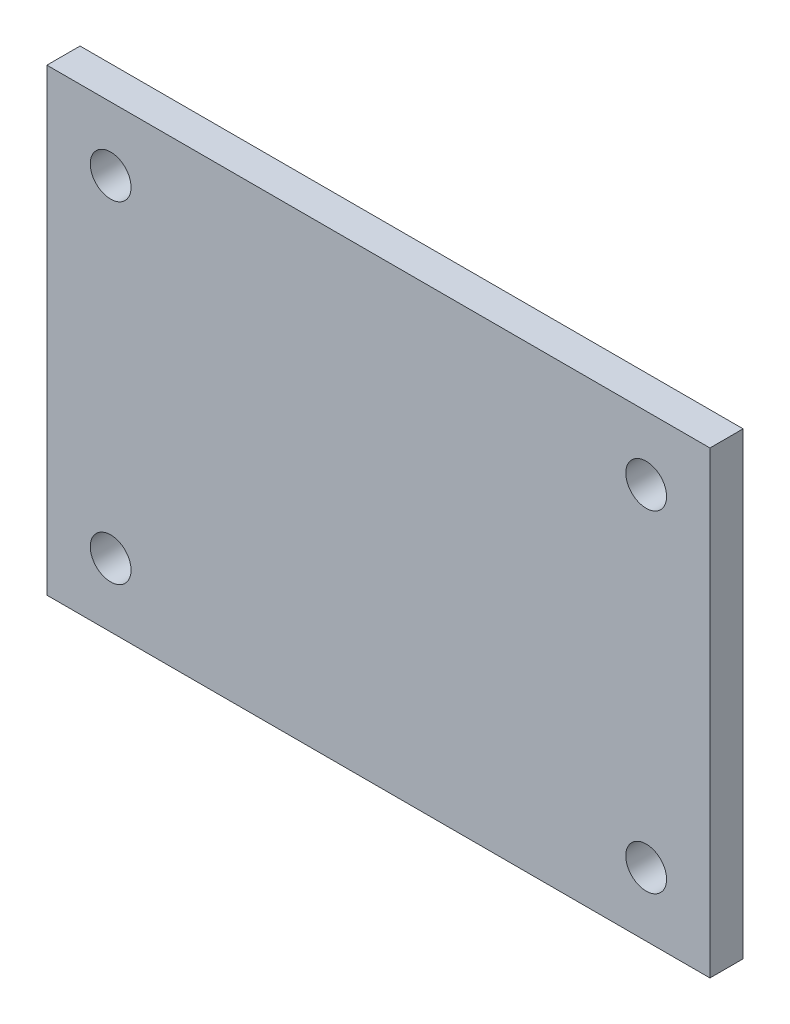
ISO-10303-21;
HEADER;
FILE_DESCRIPTION(('STEP AP214'),'2;1');
FILE_NAME('part.step','',(''),(''),'','','');
FILE_SCHEMA(('AUTOMOTIVE_DESIGN { 1 0 10303 214 1 1 1 1 }'));
ENDSEC;
DATA;
#1=APPLICATION_CONTEXT('core data for automotive mechanical design processes');
#2=APPLICATION_PROTOCOL_DEFINITION('international standard','automotive_design',2000,#1);
#3=PRODUCT_CONTEXT('',#1,'mechanical');
#4=PRODUCT('Part','Part','',(#3));
#5=PRODUCT_RELATED_PRODUCT_CATEGORY('part','',(#4));
#6=PRODUCT_DEFINITION_FORMATION('','',#4);
#7=PRODUCT_DEFINITION_CONTEXT('part definition',#1,'design');
#8=PRODUCT_DEFINITION('design','',#6,#7);
#9=PRODUCT_DEFINITION_SHAPE('','',#8);
#10=(LENGTH_UNIT() NAMED_UNIT(*) SI_UNIT(.MILLI.,.METRE.));
#11=(NAMED_UNIT(*) PLANE_ANGLE_UNIT() SI_UNIT($,.RADIAN.));
#12=(NAMED_UNIT(*) SI_UNIT($,.STERADIAN.) SOLID_ANGLE_UNIT());
#13=UNCERTAINTY_MEASURE_WITH_UNIT(LENGTH_MEASURE(1.E-05),#10,'distance_accuracy_value','');
#14=(GEOMETRIC_REPRESENTATION_CONTEXT(3) GLOBAL_UNCERTAINTY_ASSIGNED_CONTEXT((#13)) GLOBAL_UNIT_ASSIGNED_CONTEXT((#10,
#11,#12)) REPRESENTATION_CONTEXT('',''));
#15=CARTESIAN_POINT('',(0.,0.,0.));
#16=DIRECTION('',(0.,0.,1.));
#17=DIRECTION('',(1.,0.,0.));
#18=AXIS2_PLACEMENT_3D('',#15,#16,#17);
#19=CARTESIAN_POINT('',(0.,0.,0.));
#20=DIRECTION('',(0.,0.,1.));
#21=DIRECTION('',(1.,0.,0.));
#22=AXIS2_PLACEMENT_3D('',#19,#20,#21);
#23=PLANE('',#22);
#24=CARTESIAN_POINT('',(-10.5,6.5,0.));
#25=DIRECTION('',(0.,0.,1.));
#26=DIRECTION('',(1.,0.,0.));
#27=AXIS2_PLACEMENT_3D('',#24,#25,#26);
#28=CIRCLE('',#27,0.799999999999919);
#29=CARTESIAN_POINT('',(-9.70000000000008,6.5,0.));
#30=VERTEX_POINT('',#29);
#31=EDGE_CURVE('E130',#30,#30,#28,.F.);
#32=ORIENTED_EDGE('',*,*,#31,.F.);
#33=EDGE_LOOP('',(#32));
#34=FACE_BOUND('',#33,.T.);
#35=CARTESIAN_POINT('',(-10.5,-6.5,0.));
#36=DIRECTION('',(0.,0.,1.));
#37=DIRECTION('',(1.,0.,0.));
#38=AXIS2_PLACEMENT_3D('',#35,#36,#37);
#39=CIRCLE('',#38,0.799999999999919);
#40=CARTESIAN_POINT('',(-9.70000000000008,-6.5,0.));
#41=VERTEX_POINT('',#40);
#42=EDGE_CURVE('E124',#41,#41,#39,.F.);
#43=ORIENTED_EDGE('',*,*,#42,.F.);
#44=EDGE_LOOP('',(#43));
#45=FACE_BOUND('',#44,.T.);
#46=CARTESIAN_POINT('',(10.5,-6.5,0.));
#47=DIRECTION('',(0.,0.,1.));
#48=DIRECTION('',(1.,0.,0.));
#49=AXIS2_PLACEMENT_3D('',#46,#47,#48);
#50=CIRCLE('',#49,0.799999999999919);
#51=CARTESIAN_POINT('',(11.2999999999999,-6.5,0.));
#52=VERTEX_POINT('',#51);
#53=EDGE_CURVE('E118',#52,#52,#50,.F.);
#54=ORIENTED_EDGE('',*,*,#53,.F.);
#55=EDGE_LOOP('',(#54));
#56=FACE_BOUND('',#55,.T.);
#57=DIRECTION('',(0.,1.,0.));
#58=VECTOR('',#57,1.);
#59=CARTESIAN_POINT('',(13.,9.,0.));
#60=LINE('',#59,#58);
#61=CARTESIAN_POINT('',(13.,-9.,0.));
#62=VERTEX_POINT('',#61);
#63=CARTESIAN_POINT('',(13.,9.,0.));
#64=VERTEX_POINT('',#63);
#65=EDGE_CURVE('E101',#62,#64,#60,.T.);
#66=ORIENTED_EDGE('',*,*,#65,.F.);
#67=DIRECTION('',(1.,0.,0.));
#68=VECTOR('',#67,1.);
#69=CARTESIAN_POINT('',(-13.,-9.,0.));
#70=LINE('',#69,#68);
#71=CARTESIAN_POINT('',(-13.,-9.,0.));
#72=VERTEX_POINT('',#71);
#73=EDGE_CURVE('E77',#72,#62,#70,.T.);
#74=ORIENTED_EDGE('',*,*,#73,.F.);
#75=DIRECTION('',(0.,-1.,0.));
#76=VECTOR('',#75,1.);
#77=CARTESIAN_POINT('',(-13.,9.,0.));
#78=LINE('',#77,#76);
#79=CARTESIAN_POINT('',(-13.,9.,0.));
#80=VERTEX_POINT('',#79);
#81=EDGE_CURVE('E71',#80,#72,#78,.T.);
#82=ORIENTED_EDGE('',*,*,#81,.F.);
#83=DIRECTION('',(-1.,0.,0.));
#84=VECTOR('',#83,1.);
#85=CARTESIAN_POINT('',(-13.,9.,0.));
#86=LINE('',#85,#84);
#87=EDGE_CURVE('E93',#64,#80,#86,.T.);
#88=ORIENTED_EDGE('',*,*,#87,.F.);
#89=EDGE_LOOP('',(#66,#74,#82,#88));
#90=FACE_BOUND('',#89,.T.);
#91=CARTESIAN_POINT('',(10.5,6.5,0.));
#92=DIRECTION('',(0.,0.,1.));
#93=DIRECTION('',(1.,0.,0.));
#94=AXIS2_PLACEMENT_3D('',#91,#92,#93);
#95=CIRCLE('',#94,0.799999999999919);
#96=CARTESIAN_POINT('',(11.2999999999999,6.5,0.));
#97=VERTEX_POINT('',#96);
#98=EDGE_CURVE('E104',#97,#97,#95,.F.);
#99=ORIENTED_EDGE('',*,*,#98,.F.);
#100=EDGE_LOOP('',(#99));
#101=FACE_BOUND('',#100,.T.);
#102=ADVANCED_FACE('F37',(#34,#45,#56,#90,#101),#23,.F.);
#103=CARTESIAN_POINT('',(13.,9.,1.3));
#104=DIRECTION('',(-1.,0.,0.));
#105=DIRECTION('',(0.,-1.,0.));
#106=AXIS2_PLACEMENT_3D('',#103,#104,#105);
#107=PLANE('',#106);
#108=ORIENTED_EDGE('',*,*,#65,.T.);
#109=DIRECTION('',(0.,0.,-1.));
#110=VECTOR('',#109,1.);
#111=CARTESIAN_POINT('',(13.,9.,1.3));
#112=LINE('',#111,#110);
#113=CARTESIAN_POINT('',(13.,9.,1.3));
#114=VERTEX_POINT('',#113);
#115=EDGE_CURVE('E11',#114,#64,#112,.T.);
#116=ORIENTED_EDGE('',*,*,#115,.F.);
#117=DIRECTION('',(0.,1.,0.));
#118=VECTOR('',#117,1.);
#119=CARTESIAN_POINT('',(13.,9.,1.3));
#120=LINE('',#119,#118);
#121=CARTESIAN_POINT('',(13.,-9.,1.3));
#122=VERTEX_POINT('',#121);
#123=EDGE_CURVE('E89',#122,#114,#120,.T.);
#124=ORIENTED_EDGE('',*,*,#123,.F.);
#125=DIRECTION('',(0.,0.,-1.));
#126=VECTOR('',#125,1.);
#127=CARTESIAN_POINT('',(13.,-9.,1.3));
#128=LINE('',#127,#126);
#129=EDGE_CURVE('E97',#122,#62,#128,.T.);
#130=ORIENTED_EDGE('',*,*,#129,.T.);
#131=EDGE_LOOP('',(#108,#116,#124,#130));
#132=FACE_BOUND('',#131,.T.);
#133=ADVANCED_FACE('F39',(#132),#107,.F.);
#134=CARTESIAN_POINT('',(-13.,9.,1.3));
#135=DIRECTION('',(0.,-1.,0.));
#136=DIRECTION('',(0.,0.,-1.));
#137=AXIS2_PLACEMENT_3D('',#134,#135,#136);
#138=PLANE('',#137);
#139=ORIENTED_EDGE('',*,*,#87,.T.);
#140=DIRECTION('',(0.,0.,-1.));
#141=VECTOR('',#140,1.);
#142=CARTESIAN_POINT('',(-13.,9.,1.3));
#143=LINE('',#142,#141);
#144=CARTESIAN_POINT('',(-13.,9.,1.3));
#145=VERTEX_POINT('',#144);
#146=EDGE_CURVE('E46',#145,#80,#143,.T.);
#147=ORIENTED_EDGE('',*,*,#146,.F.);
#148=DIRECTION('',(-1.,0.,0.));
#149=VECTOR('',#148,1.);
#150=CARTESIAN_POINT('',(-13.,9.,1.3));
#151=LINE('',#150,#149);
#152=EDGE_CURVE('E84',#114,#145,#151,.T.);
#153=ORIENTED_EDGE('',*,*,#152,.F.);
#154=ORIENTED_EDGE('',*,*,#115,.T.);
#155=EDGE_LOOP('',(#139,#147,#153,#154));
#156=FACE_BOUND('',#155,.T.);
#157=ADVANCED_FACE('F92',(#156),#138,.F.);
#158=CARTESIAN_POINT('',(-13.,9.,1.3));
#159=DIRECTION('',(1.,0.,0.));
#160=DIRECTION('',(0.,1.,0.));
#161=AXIS2_PLACEMENT_3D('',#158,#159,#160);
#162=PLANE('',#161);
#163=ORIENTED_EDGE('',*,*,#81,.T.);
#164=DIRECTION('',(0.,0.,-1.));
#165=VECTOR('',#164,1.);
#166=CARTESIAN_POINT('',(-13.,-9.,1.3));
#167=LINE('',#166,#165);
#168=CARTESIAN_POINT('',(-13.,-9.,1.3));
#169=VERTEX_POINT('',#168);
#170=EDGE_CURVE('E94',#169,#72,#167,.T.);
#171=ORIENTED_EDGE('',*,*,#170,.F.);
#172=DIRECTION('',(0.,-1.,0.));
#173=VECTOR('',#172,1.);
#174=CARTESIAN_POINT('',(-13.,9.,1.3));
#175=LINE('',#174,#173);
#176=EDGE_CURVE('E87',#145,#169,#175,.T.);
#177=ORIENTED_EDGE('',*,*,#176,.F.);
#178=ORIENTED_EDGE('',*,*,#146,.T.);
#179=EDGE_LOOP('',(#163,#171,#177,#178));
#180=FACE_BOUND('',#179,.T.);
#181=ADVANCED_FACE('F95',(#180),#162,.F.);
#182=CARTESIAN_POINT('',(-13.,-9.,1.3));
#183=DIRECTION('',(0.,1.,0.));
#184=DIRECTION('',(0.,0.,1.));
#185=AXIS2_PLACEMENT_3D('',#182,#183,#184);
#186=PLANE('',#185);
#187=ORIENTED_EDGE('',*,*,#73,.T.);
#188=ORIENTED_EDGE('',*,*,#129,.F.);
#189=DIRECTION('',(1.,0.,0.));
#190=VECTOR('',#189,1.);
#191=CARTESIAN_POINT('',(-13.,-9.,1.3));
#192=LINE('',#191,#190);
#193=EDGE_CURVE('E54',#169,#122,#192,.T.);
#194=ORIENTED_EDGE('',*,*,#193,.F.);
#195=ORIENTED_EDGE('',*,*,#170,.T.);
#196=EDGE_LOOP('',(#187,#188,#194,#195));
#197=FACE_BOUND('',#196,.T.);
#198=ADVANCED_FACE('F109',(#197),#186,.F.);
#199=CARTESIAN_POINT('',(0.,0.,1.3));
#200=DIRECTION('',(0.,0.,1.));
#201=DIRECTION('',(1.,0.,0.));
#202=AXIS2_PLACEMENT_3D('',#199,#200,#201);
#203=PLANE('',#202);
#204=CARTESIAN_POINT('',(-10.5,6.5,1.3));
#205=DIRECTION('',(0.,0.,1.));
#206=DIRECTION('',(1.,0.,0.));
#207=AXIS2_PLACEMENT_3D('',#204,#205,#206);
#208=CIRCLE('',#207,0.799999999999997);
#209=CARTESIAN_POINT('',(-9.7,6.5,1.3));
#210=VERTEX_POINT('',#209);
#211=EDGE_CURVE('E133',#210,#210,#208,.T.);
#212=ORIENTED_EDGE('',*,*,#211,.F.);
#213=EDGE_LOOP('',(#212));
#214=FACE_BOUND('',#213,.T.);
#215=CARTESIAN_POINT('',(-10.5,-6.5,1.3));
#216=DIRECTION('',(0.,0.,1.));
#217=DIRECTION('',(1.,0.,0.));
#218=AXIS2_PLACEMENT_3D('',#215,#216,#217);
#219=CIRCLE('',#218,0.799999999999997);
#220=CARTESIAN_POINT('',(-9.7,-6.5,1.3));
#221=VERTEX_POINT('',#220);
#222=EDGE_CURVE('E127',#221,#221,#219,.T.);
#223=ORIENTED_EDGE('',*,*,#222,.F.);
#224=EDGE_LOOP('',(#223));
#225=FACE_BOUND('',#224,.T.);
#226=CARTESIAN_POINT('',(10.5,-6.5,1.3));
#227=DIRECTION('',(0.,0.,1.));
#228=DIRECTION('',(1.,0.,0.));
#229=AXIS2_PLACEMENT_3D('',#226,#227,#228);
#230=CIRCLE('',#229,0.799999999999997);
#231=CARTESIAN_POINT('',(11.3,-6.5,1.3));
#232=VERTEX_POINT('',#231);
#233=EDGE_CURVE('E121',#232,#232,#230,.T.);
#234=ORIENTED_EDGE('',*,*,#233,.F.);
#235=EDGE_LOOP('',(#234));
#236=FACE_BOUND('',#235,.T.);
#237=CARTESIAN_POINT('',(10.5,6.5,1.3));
#238=DIRECTION('',(0.,0.,1.));
#239=DIRECTION('',(1.,0.,0.));
#240=AXIS2_PLACEMENT_3D('',#237,#238,#239);
#241=CIRCLE('',#240,0.799999999999997);
#242=CARTESIAN_POINT('',(11.3,6.5,1.3));
#243=VERTEX_POINT('',#242);
#244=EDGE_CURVE('E115',#243,#243,#241,.T.);
#245=ORIENTED_EDGE('',*,*,#244,.F.);
#246=EDGE_LOOP('',(#245));
#247=FACE_BOUND('',#246,.T.);
#248=ORIENTED_EDGE('',*,*,#123,.T.);
#249=ORIENTED_EDGE('',*,*,#152,.T.);
#250=ORIENTED_EDGE('',*,*,#176,.T.);
#251=ORIENTED_EDGE('',*,*,#193,.T.);
#252=EDGE_LOOP('',(#248,#249,#250,#251));
#253=FACE_BOUND('',#252,.T.);
#254=ADVANCED_FACE('F85',(#214,#225,#236,#247,#253),#203,.T.);
#255=CARTESIAN_POINT('',(10.5,6.5,1.3));
#256=DIRECTION('',(0.,0.,1.));
#257=DIRECTION('',(1.,0.,0.));
#258=AXIS2_PLACEMENT_3D('',#255,#256,#257);
#259=CYLINDRICAL_SURFACE('',#258,0.799999999999919);
#260=ORIENTED_EDGE('',*,*,#98,.T.);
#261=EDGE_LOOP('',(#260));
#262=FACE_BOUND('',#261,.T.);
#263=ORIENTED_EDGE('',*,*,#244,.T.);
#264=EDGE_LOOP('',(#263));
#265=FACE_BOUND('',#264,.T.);
#266=ADVANCED_FACE('F153',(#262,#265),#259,.F.);
#267=CARTESIAN_POINT('',(10.5,-6.5,1.3));
#268=DIRECTION('',(0.,0.,1.));
#269=DIRECTION('',(1.,0.,0.));
#270=AXIS2_PLACEMENT_3D('',#267,#268,#269);
#271=CYLINDRICAL_SURFACE('',#270,0.799999999999919);
#272=ORIENTED_EDGE('',*,*,#53,.T.);
#273=EDGE_LOOP('',(#272));
#274=FACE_BOUND('',#273,.T.);
#275=ORIENTED_EDGE('',*,*,#233,.T.);
#276=EDGE_LOOP('',(#275));
#277=FACE_BOUND('',#276,.T.);
#278=ADVANCED_FACE('F149',(#274,#277),#271,.F.);
#279=CARTESIAN_POINT('',(-10.5,-6.5,1.3));
#280=DIRECTION('',(0.,0.,1.));
#281=DIRECTION('',(1.,0.,0.));
#282=AXIS2_PLACEMENT_3D('',#279,#280,#281);
#283=CYLINDRICAL_SURFACE('',#282,0.799999999999919);
#284=ORIENTED_EDGE('',*,*,#42,.T.);
#285=EDGE_LOOP('',(#284));
#286=FACE_BOUND('',#285,.T.);
#287=ORIENTED_EDGE('',*,*,#222,.T.);
#288=EDGE_LOOP('',(#287));
#289=FACE_BOUND('',#288,.T.);
#290=ADVANCED_FACE('F152',(#286,#289),#283,.F.);
#291=CARTESIAN_POINT('',(-10.5,6.5,1.3));
#292=DIRECTION('',(0.,0.,1.));
#293=DIRECTION('',(1.,0.,0.));
#294=AXIS2_PLACEMENT_3D('',#291,#292,#293);
#295=CYLINDRICAL_SURFACE('',#294,0.799999999999919);
#296=ORIENTED_EDGE('',*,*,#31,.T.);
#297=EDGE_LOOP('',(#296));
#298=FACE_BOUND('',#297,.T.);
#299=ORIENTED_EDGE('',*,*,#211,.T.);
#300=EDGE_LOOP('',(#299));
#301=FACE_BOUND('',#300,.T.);
#302=ADVANCED_FACE('F139',(#298,#301),#295,.F.);
#303=CLOSED_SHELL('',(#102,#133,#157,#181,#198,#254,#266,#278,#290,#302));
#304=MANIFOLD_SOLID_BREP('B2',#303);
#305=ADVANCED_BREP_SHAPE_REPRESENTATION('',(#18,#304),#14);
#306=SHAPE_DEFINITION_REPRESENTATION(#9,#305);
ENDSEC;
END-ISO-10303-21;
